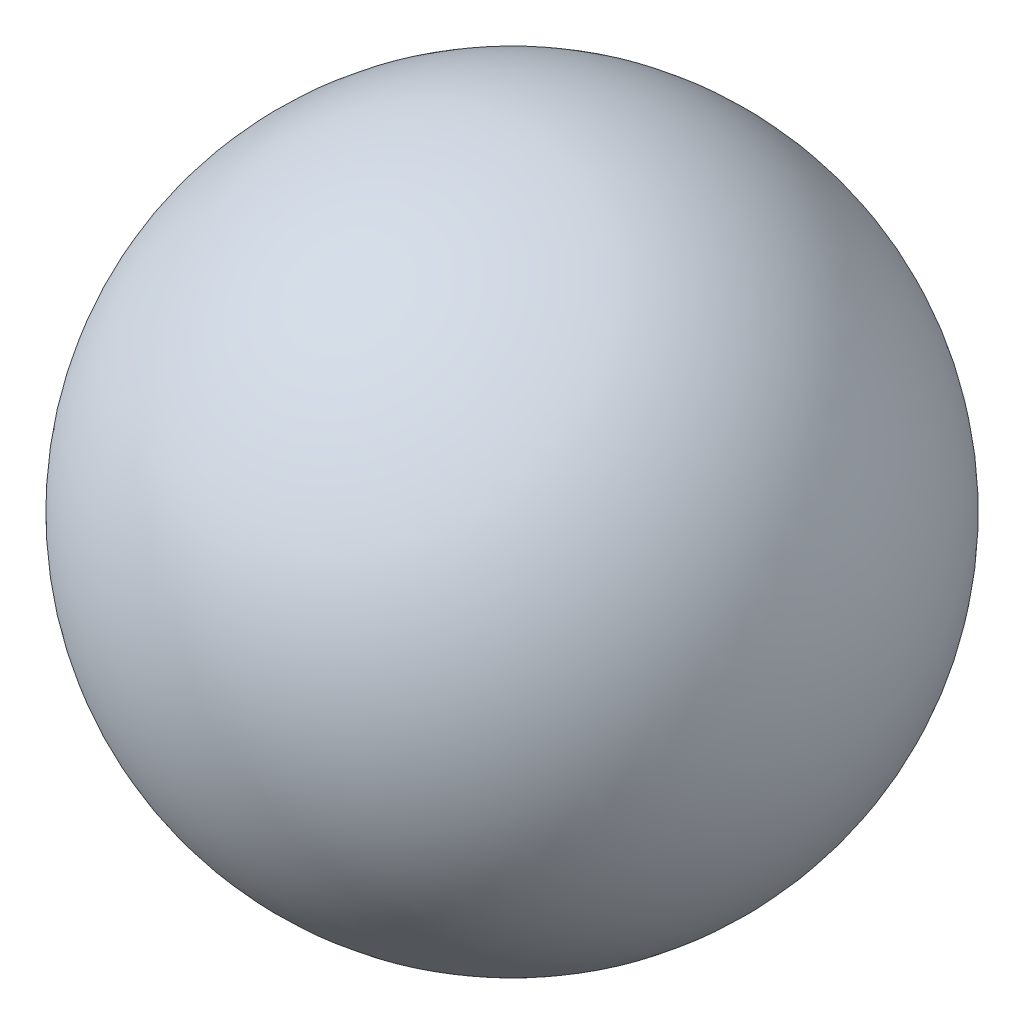
ISO-10303-21;
HEADER;
FILE_DESCRIPTION(('STEP AP214'),'2;1');
FILE_NAME('part.step','',(''),(''),'','','');
FILE_SCHEMA(('AUTOMOTIVE_DESIGN { 1 0 10303 214 1 1 1 1 }'));
ENDSEC;
DATA;
#1=APPLICATION_CONTEXT('core data for automotive mechanical design processes');
#2=APPLICATION_PROTOCOL_DEFINITION('international standard','automotive_design',2000,#1);
#3=PRODUCT_CONTEXT('',#1,'mechanical');
#4=PRODUCT('Part','Part','',(#3));
#5=PRODUCT_RELATED_PRODUCT_CATEGORY('part','',(#4));
#6=PRODUCT_DEFINITION_FORMATION('','',#4);
#7=PRODUCT_DEFINITION_CONTEXT('part definition',#1,'design');
#8=PRODUCT_DEFINITION('design','',#6,#7);
#9=PRODUCT_DEFINITION_SHAPE('','',#8);
#10=(LENGTH_UNIT() NAMED_UNIT(*) SI_UNIT(.MILLI.,.METRE.));
#11=(NAMED_UNIT(*) PLANE_ANGLE_UNIT() SI_UNIT($,.RADIAN.));
#12=(NAMED_UNIT(*) SI_UNIT($,.STERADIAN.) SOLID_ANGLE_UNIT());
#13=UNCERTAINTY_MEASURE_WITH_UNIT(LENGTH_MEASURE(1.E-05),#10,'distance_accuracy_value','');
#14=(GEOMETRIC_REPRESENTATION_CONTEXT(3) GLOBAL_UNCERTAINTY_ASSIGNED_CONTEXT((#13)) GLOBAL_UNIT_ASSIGNED_CONTEXT((#10,
#11,#12)) REPRESENTATION_CONTEXT('',''));
#15=CARTESIAN_POINT('',(0.,0.,0.));
#16=DIRECTION('',(0.,0.,1.));
#17=DIRECTION('',(1.,0.,0.));
#18=AXIS2_PLACEMENT_3D('',#15,#16,#17);
#19=CARTESIAN_POINT('',(0.,0.,0.));
#20=DIRECTION('',(0.,1.,0.));
#21=DIRECTION('',(1.,0.,0.));
#22=AXIS2_PLACEMENT_3D('',#19,#20,#21);
#23=SPHERICAL_SURFACE('',#22,20.);
#24=CARTESIAN_POINT('',(0.,20.,0.));
#25=VERTEX_POINT('',#24);
#26=VERTEX_LOOP('',#25);
#27=FACE_BOUND('',#26,.T.);
#28=ADVANCED_FACE('F38',(#27),#23,.T.);
#29=CLOSED_SHELL('',(#28));
#30=CARTESIAN_POINT('',(0.,0.,0.));
#31=DIRECTION('',(0.,1.,0.));
#32=DIRECTION('',(-1.,0.,0.));
#33=AXIS2_PLACEMENT_3D('',#30,#31,#32);
#34=SPHERICAL_SURFACE('',#33,19.475);
#35=CARTESIAN_POINT('',(0.,19.475,0.));
#36=VERTEX_POINT('',#35);
#37=VERTEX_LOOP('',#36);
#38=FACE_BOUND('',#37,.T.);
#39=ADVANCED_FACE('F51',(#38),#34,.F.);
#40=CLOSED_SHELL('',(#39));
#41=ORIENTED_CLOSED_SHELL('',*,#40,.T.);
#42=BREP_WITH_VOIDS('B2',#29,(#41));
#43=ADVANCED_BREP_SHAPE_REPRESENTATION('',(#18,#42),#14);
#44=SHAPE_DEFINITION_REPRESENTATION(#9,#43);
ENDSEC;
END-ISO-10303-21;
